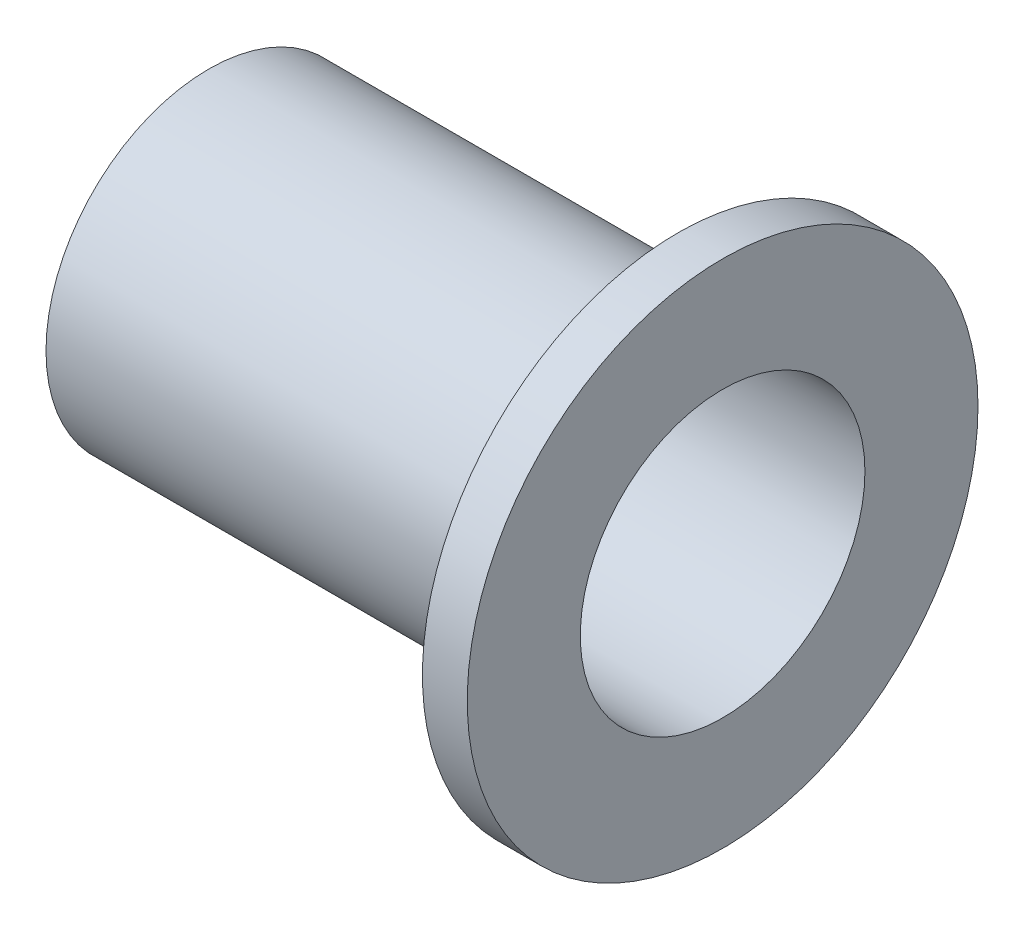
ISO-10303-21;
HEADER;
FILE_DESCRIPTION(('STEP AP214'),'2;1');
FILE_NAME('part.step','',(''),(''),'','','');
FILE_SCHEMA(('AUTOMOTIVE_DESIGN { 1 0 10303 214 1 1 1 1 }'));
ENDSEC;
DATA;
#1=APPLICATION_CONTEXT('core data for automotive mechanical design processes');
#2=APPLICATION_PROTOCOL_DEFINITION('international standard','automotive_design',2000,#1);
#3=PRODUCT_CONTEXT('',#1,'mechanical');
#4=PRODUCT('Part','Part','',(#3));
#5=PRODUCT_RELATED_PRODUCT_CATEGORY('part','',(#4));
#6=PRODUCT_DEFINITION_FORMATION('','',#4);
#7=PRODUCT_DEFINITION_CONTEXT('part definition',#1,'design');
#8=PRODUCT_DEFINITION('design','',#6,#7);
#9=PRODUCT_DEFINITION_SHAPE('','',#8);
#10=(LENGTH_UNIT() NAMED_UNIT(*) SI_UNIT(.MILLI.,.METRE.));
#11=(NAMED_UNIT(*) PLANE_ANGLE_UNIT() SI_UNIT($,.RADIAN.));
#12=(NAMED_UNIT(*) SI_UNIT($,.STERADIAN.) SOLID_ANGLE_UNIT());
#13=UNCERTAINTY_MEASURE_WITH_UNIT(LENGTH_MEASURE(1.E-05),#10,'distance_accuracy_value','');
#14=(GEOMETRIC_REPRESENTATION_CONTEXT(3) GLOBAL_UNCERTAINTY_ASSIGNED_CONTEXT((#13)) GLOBAL_UNIT_ASSIGNED_CONTEXT((#10,
#11,#12)) REPRESENTATION_CONTEXT('',''));
#15=CARTESIAN_POINT('',(0.,0.,0.));
#16=DIRECTION('',(0.,0.,1.));
#17=DIRECTION('',(1.,0.,0.));
#18=AXIS2_PLACEMENT_3D('',#15,#16,#17);
#19=CARTESIAN_POINT('',(140.132,0.,225.));
#20=DIRECTION('',(-1.,0.,0.));
#21=DIRECTION('',(0.,0.,-1.));
#22=AXIS2_PLACEMENT_3D('',#19,#20,#21);
#23=CYLINDRICAL_SURFACE('',#22,11.1125);
#24=CARTESIAN_POINT('',(140.132,0.,225.));
#25=DIRECTION('',(1.,0.,0.));
#26=DIRECTION('',(0.,0.,-1.));
#27=AXIS2_PLACEMENT_3D('',#24,#25,#26);
#28=CIRCLE('',#27,11.1125);
#29=CARTESIAN_POINT('',(140.132,0.,213.8875));
#30=VERTEX_POINT('',#29);
#31=EDGE_CURVE('E19',#30,#30,#28,.T.);
#32=ORIENTED_EDGE('',*,*,#31,.T.);
#33=DIRECTION('',(-1.,0.,0.));
#34=VECTOR('',#33,1.);
#35=CARTESIAN_POINT('',(140.132,0.,213.8875));
#36=LINE('',#35,#34);
#37=CARTESIAN_POINT('',(100.,0.,213.8875));
#38=VERTEX_POINT('',#37);
#39=EDGE_CURVE('E10',#30,#38,#36,.T.);
#40=ORIENTED_EDGE('',*,*,#39,.T.);
#41=CARTESIAN_POINT('',(100.,0.,225.));
#42=DIRECTION('',(1.,0.,0.));
#43=DIRECTION('',(0.,0.,-1.));
#44=AXIS2_PLACEMENT_3D('',#41,#42,#43);
#45=CIRCLE('',#44,11.1125);
#46=EDGE_CURVE('E75',#38,#38,#45,.T.);
#47=ORIENTED_EDGE('',*,*,#46,.F.);
#48=ORIENTED_EDGE('',*,*,#39,.F.);
#49=EDGE_LOOP('',(#32,#40,#47,#48));
#50=FACE_BOUND('',#49,.T.);
#51=ADVANCED_FACE('F16',(#50),#23,.F.);
#52=CARTESIAN_POINT('',(140.132,0.,225.));
#53=DIRECTION('',(1.,0.,0.));
#54=DIRECTION('',(0.,0.,1.));
#55=AXIS2_PLACEMENT_3D('',#52,#53,#54);
#56=PLANE('',#55);
#57=ORIENTED_EDGE('',*,*,#31,.F.);
#58=EDGE_LOOP('',(#57));
#59=FACE_BOUND('',#58,.T.);
#60=CARTESIAN_POINT('',(140.132,0.,225.));
#61=DIRECTION('',(1.,0.,0.));
#62=DIRECTION('',(0.,0.,-1.));
#63=AXIS2_PLACEMENT_3D('',#60,#61,#62);
#64=CIRCLE('',#63,19.94);
#65=CARTESIAN_POINT('',(140.132,0.,205.06));
#66=VERTEX_POINT('',#65);
#67=EDGE_CURVE('E81',#66,#66,#64,.T.);
#68=ORIENTED_EDGE('',*,*,#67,.T.);
#69=EDGE_LOOP('',(#68));
#70=FACE_BOUND('',#69,.T.);
#71=ADVANCED_FACE('F97',(#59,#70),#56,.T.);
#72=CARTESIAN_POINT('',(136.632,0.,225.));
#73=DIRECTION('',(1.,0.,0.));
#74=DIRECTION('',(0.,0.,-1.));
#75=AXIS2_PLACEMENT_3D('',#72,#73,#74);
#76=CYLINDRICAL_SURFACE('',#75,19.94);
#77=CARTESIAN_POINT('',(136.632,0.,225.));
#78=DIRECTION('',(1.,0.,0.));
#79=DIRECTION('',(0.,0.,-1.));
#80=AXIS2_PLACEMENT_3D('',#77,#78,#79);
#81=CIRCLE('',#80,19.94);
#82=CARTESIAN_POINT('',(136.632,0.,205.06));
#83=VERTEX_POINT('',#82);
#84=EDGE_CURVE('E82',#83,#83,#81,.T.);
#85=ORIENTED_EDGE('',*,*,#84,.T.);
#86=DIRECTION('',(1.,0.,0.));
#87=VECTOR('',#86,1.);
#88=CARTESIAN_POINT('',(136.632,0.,205.06));
#89=LINE('',#88,#87);
#90=EDGE_CURVE('E79',#83,#66,#89,.T.);
#91=ORIENTED_EDGE('',*,*,#90,.T.);
#92=ORIENTED_EDGE('',*,*,#67,.F.);
#93=ORIENTED_EDGE('',*,*,#90,.F.);
#94=EDGE_LOOP('',(#85,#91,#92,#93));
#95=FACE_BOUND('',#94,.T.);
#96=ADVANCED_FACE('F99',(#95),#76,.T.);
#97=CARTESIAN_POINT('',(133.132,0.,225.));
#98=DIRECTION('',(1.,0.,0.));
#99=DIRECTION('',(0.,0.,-1.));
#100=AXIS2_PLACEMENT_3D('',#97,#98,#99);
#101=CONICAL_SURFACE('',#100,12.7,1.120496089743);
#102=CARTESIAN_POINT('',(133.132,0.,225.));
#103=DIRECTION('',(1.,0.,0.));
#104=DIRECTION('',(0.,0.,-1.));
#105=AXIS2_PLACEMENT_3D('',#102,#103,#104);
#106=CIRCLE('',#105,12.7);
#107=CARTESIAN_POINT('',(133.132,0.,212.3));
#108=VERTEX_POINT('',#107);
#109=EDGE_CURVE('E65',#108,#108,#106,.T.);
#110=ORIENTED_EDGE('',*,*,#109,.T.);
#111=DIRECTION('',(0.435235862085962,0.,-0.900316469000922));
#112=VECTOR('',#111,1.);
#113=CARTESIAN_POINT('',(133.132,0.,212.3));
#114=LINE('',#113,#112);
#115=EDGE_CURVE('E72',#108,#83,#114,.T.);
#116=ORIENTED_EDGE('',*,*,#115,.T.);
#117=ORIENTED_EDGE('',*,*,#84,.F.);
#118=ORIENTED_EDGE('',*,*,#115,.F.);
#119=EDGE_LOOP('',(#110,#116,#117,#118));
#120=FACE_BOUND('',#119,.T.);
#121=ADVANCED_FACE('F105',(#120),#101,.T.);
#122=CARTESIAN_POINT('',(100.,0.,225.));
#123=DIRECTION('',(1.,0.,0.));
#124=DIRECTION('',(0.,0.,-1.));
#125=AXIS2_PLACEMENT_3D('',#122,#123,#124);
#126=CYLINDRICAL_SURFACE('',#125,12.7);
#127=CARTESIAN_POINT('',(100.,0.,225.));
#128=DIRECTION('',(1.,0.,0.));
#129=DIRECTION('',(0.,0.,-1.));
#130=AXIS2_PLACEMENT_3D('',#127,#128,#129);
#131=CIRCLE('',#130,12.7);
#132=CARTESIAN_POINT('',(100.,0.,212.3));
#133=VERTEX_POINT('',#132);
#134=EDGE_CURVE('E63',#133,#133,#131,.T.);
#135=ORIENTED_EDGE('',*,*,#134,.T.);
#136=DIRECTION('',(1.,0.,0.));
#137=VECTOR('',#136,1.);
#138=CARTESIAN_POINT('',(100.,0.,212.3));
#139=LINE('',#138,#137);
#140=EDGE_CURVE('E60',#133,#108,#139,.T.);
#141=ORIENTED_EDGE('',*,*,#140,.T.);
#142=ORIENTED_EDGE('',*,*,#109,.F.);
#143=ORIENTED_EDGE('',*,*,#140,.F.);
#144=EDGE_LOOP('',(#135,#141,#142,#143));
#145=FACE_BOUND('',#144,.T.);
#146=ADVANCED_FACE('F61',(#145),#126,.T.);
#147=CARTESIAN_POINT('',(100.,0.,225.));
#148=DIRECTION('',(1.,0.,0.));
#149=DIRECTION('',(0.,0.,1.));
#150=AXIS2_PLACEMENT_3D('',#147,#148,#149);
#151=PLANE('',#150);
#152=ORIENTED_EDGE('',*,*,#134,.F.);
#153=EDGE_LOOP('',(#152));
#154=FACE_BOUND('',#153,.T.);
#155=ORIENTED_EDGE('',*,*,#46,.T.);
#156=EDGE_LOOP('',(#155));
#157=FACE_BOUND('',#156,.T.);
#158=ADVANCED_FACE('F114',(#154,#157),#151,.F.);
#159=CLOSED_SHELL('',(#51,#71,#96,#121,#146,#158));
#160=MANIFOLD_SOLID_BREP('B1',#159);
#161=ADVANCED_BREP_SHAPE_REPRESENTATION('',(#18,#160),#14);
#162=SHAPE_DEFINITION_REPRESENTATION(#9,#161);
ENDSEC;
END-ISO-10303-21;
